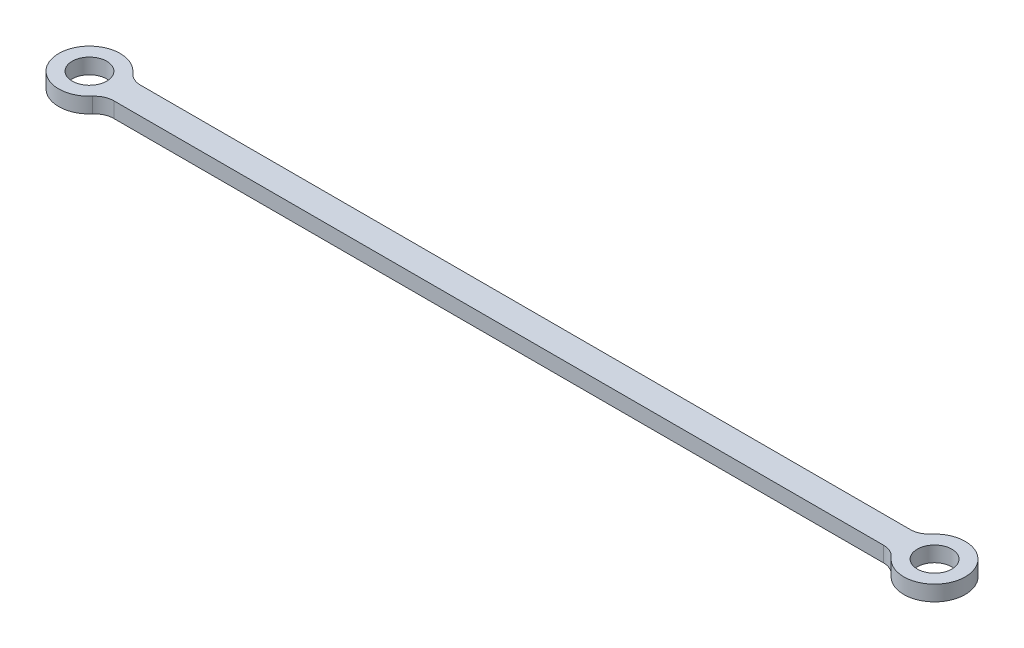
ISO-10303-21;
HEADER;
FILE_DESCRIPTION(('STEP AP214'),'2;1');
FILE_NAME('part.step','',(''),(''),'','','');
FILE_SCHEMA(('AUTOMOTIVE_DESIGN { 1 0 10303 214 1 1 1 1 }'));
ENDSEC;
DATA;
#1=APPLICATION_CONTEXT('core data for automotive mechanical design processes');
#2=APPLICATION_PROTOCOL_DEFINITION('international standard','automotive_design',2000,#1);
#3=PRODUCT_CONTEXT('',#1,'mechanical');
#4=PRODUCT('Part','Part','',(#3));
#5=PRODUCT_RELATED_PRODUCT_CATEGORY('part','',(#4));
#6=PRODUCT_DEFINITION_FORMATION('','',#4);
#7=PRODUCT_DEFINITION_CONTEXT('part definition',#1,'design');
#8=PRODUCT_DEFINITION('design','',#6,#7);
#9=PRODUCT_DEFINITION_SHAPE('','',#8);
#10=(LENGTH_UNIT() NAMED_UNIT(*) SI_UNIT(.MILLI.,.METRE.));
#11=(NAMED_UNIT(*) PLANE_ANGLE_UNIT() SI_UNIT($,.RADIAN.));
#12=(NAMED_UNIT(*) SI_UNIT($,.STERADIAN.) SOLID_ANGLE_UNIT());
#13=UNCERTAINTY_MEASURE_WITH_UNIT(LENGTH_MEASURE(1.E-05),#10,'distance_accuracy_value','');
#14=(GEOMETRIC_REPRESENTATION_CONTEXT(3) GLOBAL_UNCERTAINTY_ASSIGNED_CONTEXT((#13)) GLOBAL_UNIT_ASSIGNED_CONTEXT((#10,
#11,#12)) REPRESENTATION_CONTEXT('',''));
#15=CARTESIAN_POINT('',(0.,0.,0.));
#16=DIRECTION('',(0.,0.,1.));
#17=DIRECTION('',(1.,0.,0.));
#18=AXIS2_PLACEMENT_3D('',#15,#16,#17);
#19=CARTESIAN_POINT('',(-100.163842213547,4.,8.5));
#20=DIRECTION('',(0.,1.,0.));
#21=DIRECTION('',(0.,0.,1.));
#22=AXIS2_PLACEMENT_3D('',#19,#20,#21);
#23=PLANE('',#22);
#24=CARTESIAN_POINT('',(-110.,4.,0.));
#25=DIRECTION('',(0.,1.,0.));
#26=DIRECTION('',(0.,0.,1.));
#27=AXIS2_PLACEMENT_3D('',#24,#25,#26);
#28=CIRCLE('',#27,4.5);
#29=CARTESIAN_POINT('',(-110.,4.,4.5));
#30=VERTEX_POINT('',#29);
#31=EDGE_CURVE('E137',#30,#30,#28,.T.);
#32=ORIENTED_EDGE('',*,*,#31,.F.);
#33=EDGE_LOOP('',(#32));
#34=FACE_BOUND('',#33,.T.);
#35=CARTESIAN_POINT('',(-100.163842213547,4.,8.5));
#36=DIRECTION('',(0.,-1.,0.));
#37=DIRECTION('',(0.,0.,1.));
#38=AXIS2_PLACEMENT_3D('',#35,#36,#37);
#39=CIRCLE('',#38,5.);
#40=CARTESIAN_POINT('',(-103.946979823721,4.,5.23076923076923));
#41=VERTEX_POINT('',#40);
#42=CARTESIAN_POINT('',(-100.163842213547,4.,3.5));
#43=VERTEX_POINT('',#42);
#44=EDGE_CURVE('E148',#41,#43,#39,.T.);
#45=ORIENTED_EDGE('',*,*,#44,.T.);
#46=DIRECTION('',(1.,0.,0.));
#47=VECTOR('',#46,1.);
#48=CARTESIAN_POINT('',(100.163842213547,4.,3.5));
#49=LINE('',#48,#47);
#50=CARTESIAN_POINT('',(100.163842213547,4.,3.5));
#51=VERTEX_POINT('',#50);
#52=EDGE_CURVE('E96',#43,#51,#49,.T.);
#53=ORIENTED_EDGE('',*,*,#52,.T.);
#54=CARTESIAN_POINT('',(100.163842213547,4.,8.5));
#55=DIRECTION('',(0.,-1.,0.));
#56=DIRECTION('',(0.,0.,-1.));
#57=AXIS2_PLACEMENT_3D('',#54,#55,#56);
#58=CIRCLE('',#57,5.);
#59=CARTESIAN_POINT('',(103.946979823721,4.,5.23076923076923));
#60=VERTEX_POINT('',#59);
#61=EDGE_CURVE('E163',#51,#60,#58,.T.);
#62=ORIENTED_EDGE('',*,*,#61,.T.);
#63=CARTESIAN_POINT('',(110.,4.,0.));
#64=DIRECTION('',(0.,1.,0.));
#65=DIRECTION('',(0.,0.,-1.));
#66=AXIS2_PLACEMENT_3D('',#63,#64,#65);
#67=CIRCLE('',#66,8.00000000000001);
#68=CARTESIAN_POINT('',(103.946979823721,4.,-5.23076923076923));
#69=VERTEX_POINT('',#68);
#70=EDGE_CURVE('E176',#60,#69,#67,.T.);
#71=ORIENTED_EDGE('',*,*,#70,.T.);
#72=CARTESIAN_POINT('',(100.163842213547,4.,-8.5));
#73=DIRECTION('',(0.,-1.,0.));
#74=DIRECTION('',(0.,0.,1.));
#75=AXIS2_PLACEMENT_3D('',#72,#73,#74);
#76=CIRCLE('',#75,5.);
#77=CARTESIAN_POINT('',(100.163842213547,4.,-3.5));
#78=VERTEX_POINT('',#77);
#79=EDGE_CURVE('E115',#69,#78,#76,.T.);
#80=ORIENTED_EDGE('',*,*,#79,.T.);
#81=DIRECTION('',(-1.,0.,0.));
#82=VECTOR('',#81,1.);
#83=CARTESIAN_POINT('',(-100.163842213547,4.,-3.5));
#84=LINE('',#83,#82);
#85=CARTESIAN_POINT('',(-100.163842213547,4.,-3.5));
#86=VERTEX_POINT('',#85);
#87=EDGE_CURVE('E109',#78,#86,#84,.T.);
#88=ORIENTED_EDGE('',*,*,#87,.T.);
#89=CARTESIAN_POINT('',(-100.163842213547,4.,-8.5));
#90=DIRECTION('',(0.,-1.,0.));
#91=DIRECTION('',(0.,0.,-1.));
#92=AXIS2_PLACEMENT_3D('',#89,#90,#91);
#93=CIRCLE('',#92,5.);
#94=CARTESIAN_POINT('',(-103.946979823721,4.,-5.23076923076923));
#95=VERTEX_POINT('',#94);
#96=EDGE_CURVE('E113',#86,#95,#93,.T.);
#97=ORIENTED_EDGE('',*,*,#96,.T.);
#98=CARTESIAN_POINT('',(-110.,4.,0.));
#99=DIRECTION('',(0.,1.,0.));
#100=DIRECTION('',(0.,0.,1.));
#101=AXIS2_PLACEMENT_3D('',#98,#99,#100);
#102=CIRCLE('',#101,8.00000000000001);
#103=EDGE_CURVE('E53',#95,#41,#102,.T.);
#104=ORIENTED_EDGE('',*,*,#103,.T.);
#105=EDGE_LOOP('',(#45,#53,#62,#71,#80,#88,#97,#104));
#106=FACE_BOUND('',#105,.T.);
#107=CARTESIAN_POINT('',(110.,4.,0.));
#108=DIRECTION('',(0.,1.,0.));
#109=DIRECTION('',(0.,0.,1.));
#110=AXIS2_PLACEMENT_3D('',#107,#108,#109);
#111=CIRCLE('',#110,4.5);
#112=CARTESIAN_POINT('',(110.,4.,4.5));
#113=VERTEX_POINT('',#112);
#114=EDGE_CURVE('E185',#113,#113,#111,.T.);
#115=ORIENTED_EDGE('',*,*,#114,.F.);
#116=EDGE_LOOP('',(#115));
#117=FACE_BOUND('',#116,.T.);
#118=ADVANCED_FACE('F36',(#34,#106,#117),#23,.T.);
#119=CARTESIAN_POINT('',(-100.163842213547,0.,8.5));
#120=DIRECTION('',(0.,1.,0.));
#121=DIRECTION('',(0.,0.,1.));
#122=AXIS2_PLACEMENT_3D('',#119,#120,#121);
#123=PLANE('',#122);
#124=CARTESIAN_POINT('',(-100.163842213547,0.,8.5));
#125=DIRECTION('',(0.,-1.,0.));
#126=DIRECTION('',(0.,0.,1.));
#127=AXIS2_PLACEMENT_3D('',#124,#125,#126);
#128=CIRCLE('',#127,5.);
#129=CARTESIAN_POINT('',(-103.946979823721,0.,5.23076923076923));
#130=VERTEX_POINT('',#129);
#131=CARTESIAN_POINT('',(-100.163842213547,0.,3.5));
#132=VERTEX_POINT('',#131);
#133=EDGE_CURVE('E133',#130,#132,#128,.T.);
#134=ORIENTED_EDGE('',*,*,#133,.F.);
#135=CARTESIAN_POINT('',(-110.,0.,0.));
#136=DIRECTION('',(0.,1.,0.));
#137=DIRECTION('',(0.,0.,1.));
#138=AXIS2_PLACEMENT_3D('',#135,#136,#137);
#139=CIRCLE('',#138,8.00000000000001);
#140=CARTESIAN_POINT('',(-103.946979823721,0.,-5.23076923076923));
#141=VERTEX_POINT('',#140);
#142=EDGE_CURVE('E88',#141,#130,#139,.T.);
#143=ORIENTED_EDGE('',*,*,#142,.F.);
#144=CARTESIAN_POINT('',(-100.163842213547,0.,-8.5));
#145=DIRECTION('',(0.,-1.,0.));
#146=DIRECTION('',(0.,0.,-1.));
#147=AXIS2_PLACEMENT_3D('',#144,#145,#146);
#148=CIRCLE('',#147,5.);
#149=CARTESIAN_POINT('',(-100.163842213547,0.,-3.5));
#150=VERTEX_POINT('',#149);
#151=EDGE_CURVE('E82',#150,#141,#148,.T.);
#152=ORIENTED_EDGE('',*,*,#151,.F.);
#153=DIRECTION('',(-1.,0.,0.));
#154=VECTOR('',#153,1.);
#155=CARTESIAN_POINT('',(-100.163842213547,0.,-3.5));
#156=LINE('',#155,#154);
#157=CARTESIAN_POINT('',(100.163842213547,0.,-3.5));
#158=VERTEX_POINT('',#157);
#159=EDGE_CURVE('E123',#158,#150,#156,.T.);
#160=ORIENTED_EDGE('',*,*,#159,.F.);
#161=CARTESIAN_POINT('',(100.163842213547,0.,-8.5));
#162=DIRECTION('',(0.,-1.,0.));
#163=DIRECTION('',(0.,0.,1.));
#164=AXIS2_PLACEMENT_3D('',#161,#162,#163);
#165=CIRCLE('',#164,5.);
#166=CARTESIAN_POINT('',(103.946979823721,0.,-5.23076923076923));
#167=VERTEX_POINT('',#166);
#168=EDGE_CURVE('E143',#167,#158,#165,.T.);
#169=ORIENTED_EDGE('',*,*,#168,.F.);
#170=CARTESIAN_POINT('',(110.,0.,0.));
#171=DIRECTION('',(0.,1.,0.));
#172=DIRECTION('',(0.,0.,-1.));
#173=AXIS2_PLACEMENT_3D('',#170,#171,#172);
#174=CIRCLE('',#173,8.00000000000001);
#175=CARTESIAN_POINT('',(103.946979823721,0.,5.23076923076923));
#176=VERTEX_POINT('',#175);
#177=EDGE_CURVE('E141',#176,#167,#174,.T.);
#178=ORIENTED_EDGE('',*,*,#177,.F.);
#179=CARTESIAN_POINT('',(100.163842213547,0.,8.5));
#180=DIRECTION('',(0.,-1.,0.));
#181=DIRECTION('',(0.,0.,-1.));
#182=AXIS2_PLACEMENT_3D('',#179,#180,#181);
#183=CIRCLE('',#182,5.);
#184=CARTESIAN_POINT('',(100.163842213547,0.,3.5));
#185=VERTEX_POINT('',#184);
#186=EDGE_CURVE('E139',#185,#176,#183,.T.);
#187=ORIENTED_EDGE('',*,*,#186,.F.);
#188=DIRECTION('',(1.,0.,0.));
#189=VECTOR('',#188,1.);
#190=CARTESIAN_POINT('',(100.163842213547,0.,3.5));
#191=LINE('',#190,#189);
#192=EDGE_CURVE('E136',#132,#185,#191,.T.);
#193=ORIENTED_EDGE('',*,*,#192,.F.);
#194=EDGE_LOOP('',(#134,#143,#152,#160,#169,#178,#187,#193));
#195=FACE_BOUND('',#194,.T.);
#196=CARTESIAN_POINT('',(-110.,0.,0.));
#197=DIRECTION('',(0.,1.,0.));
#198=DIRECTION('',(0.,0.,1.));
#199=AXIS2_PLACEMENT_3D('',#196,#197,#198);
#200=CIRCLE('',#199,4.5);
#201=CARTESIAN_POINT('',(-110.,0.,4.5));
#202=VERTEX_POINT('',#201);
#203=EDGE_CURVE('E182',#202,#202,#200,.T.);
#204=ORIENTED_EDGE('',*,*,#203,.T.);
#205=EDGE_LOOP('',(#204));
#206=FACE_BOUND('',#205,.T.);
#207=CARTESIAN_POINT('',(110.,0.,0.));
#208=DIRECTION('',(0.,1.,0.));
#209=DIRECTION('',(0.,0.,1.));
#210=AXIS2_PLACEMENT_3D('',#207,#208,#209);
#211=CIRCLE('',#210,4.5);
#212=CARTESIAN_POINT('',(110.,0.,4.5));
#213=VERTEX_POINT('',#212);
#214=EDGE_CURVE('E188',#213,#213,#211,.T.);
#215=ORIENTED_EDGE('',*,*,#214,.T.);
#216=EDGE_LOOP('',(#215));
#217=FACE_BOUND('',#216,.T.);
#218=ADVANCED_FACE('F167',(#195,#206,#217),#123,.F.);
#219=CARTESIAN_POINT('',(-100.163842213547,4.,8.5));
#220=DIRECTION('',(0.,-1.,0.));
#221=DIRECTION('',(0.,0.,-1.));
#222=AXIS2_PLACEMENT_3D('',#219,#220,#221);
#223=CYLINDRICAL_SURFACE('',#222,5.);
#224=ORIENTED_EDGE('',*,*,#133,.T.);
#225=DIRECTION('',(0.,-1.,0.));
#226=VECTOR('',#225,1.);
#227=CARTESIAN_POINT('',(-100.163842213547,4.,3.5));
#228=LINE('',#227,#226);
#229=EDGE_CURVE('E11',#43,#132,#228,.T.);
#230=ORIENTED_EDGE('',*,*,#229,.F.);
#231=ORIENTED_EDGE('',*,*,#44,.F.);
#232=DIRECTION('',(0.,-1.,0.));
#233=VECTOR('',#232,1.);
#234=CARTESIAN_POINT('',(-103.946979823721,4.,5.23076923076923));
#235=LINE('',#234,#233);
#236=EDGE_CURVE('E129',#41,#130,#235,.T.);
#237=ORIENTED_EDGE('',*,*,#236,.T.);
#238=EDGE_LOOP('',(#224,#230,#231,#237));
#239=FACE_BOUND('',#238,.T.);
#240=ADVANCED_FACE('F38',(#239),#223,.F.);
#241=CARTESIAN_POINT('',(100.163842213547,4.,3.5));
#242=DIRECTION('',(0.,0.,-1.));
#243=DIRECTION('',(-1.,0.,0.));
#244=AXIS2_PLACEMENT_3D('',#241,#242,#243);
#245=PLANE('',#244);
#246=ORIENTED_EDGE('',*,*,#192,.T.);
#247=DIRECTION('',(0.,-1.,0.));
#248=VECTOR('',#247,1.);
#249=CARTESIAN_POINT('',(100.163842213547,4.,3.5));
#250=LINE('',#249,#248);
#251=EDGE_CURVE('E45',#51,#185,#250,.T.);
#252=ORIENTED_EDGE('',*,*,#251,.F.);
#253=ORIENTED_EDGE('',*,*,#52,.F.);
#254=ORIENTED_EDGE('',*,*,#229,.T.);
#255=EDGE_LOOP('',(#246,#252,#253,#254));
#256=FACE_BOUND('',#255,.T.);
#257=ADVANCED_FACE('F220',(#256),#245,.F.);
#258=CARTESIAN_POINT('',(100.163842213547,4.,8.5));
#259=DIRECTION('',(0.,-1.,0.));
#260=DIRECTION('',(0.,0.,-1.));
#261=AXIS2_PLACEMENT_3D('',#258,#259,#260);
#262=CYLINDRICAL_SURFACE('',#261,5.);
#263=ORIENTED_EDGE('',*,*,#186,.T.);
#264=DIRECTION('',(0.,-1.,0.));
#265=VECTOR('',#264,1.);
#266=CARTESIAN_POINT('',(103.946979823721,4.,5.23076923076923));
#267=LINE('',#266,#265);
#268=EDGE_CURVE('E155',#60,#176,#267,.T.);
#269=ORIENTED_EDGE('',*,*,#268,.F.);
#270=ORIENTED_EDGE('',*,*,#61,.F.);
#271=ORIENTED_EDGE('',*,*,#251,.T.);
#272=EDGE_LOOP('',(#263,#269,#270,#271));
#273=FACE_BOUND('',#272,.T.);
#274=ADVANCED_FACE('F161',(#273),#262,.F.);
#275=CARTESIAN_POINT('',(110.,4.,0.));
#276=DIRECTION('',(0.,-1.,0.));
#277=DIRECTION('',(0.,0.,-1.));
#278=AXIS2_PLACEMENT_3D('',#275,#276,#277);
#279=CYLINDRICAL_SURFACE('',#278,8.00000000000001);
#280=ORIENTED_EDGE('',*,*,#177,.T.);
#281=DIRECTION('',(0.,-1.,0.));
#282=VECTOR('',#281,1.);
#283=CARTESIAN_POINT('',(103.946979823721,4.,-5.23076923076923));
#284=LINE('',#283,#282);
#285=EDGE_CURVE('E152',#69,#167,#284,.T.);
#286=ORIENTED_EDGE('',*,*,#285,.F.);
#287=ORIENTED_EDGE('',*,*,#70,.F.);
#288=ORIENTED_EDGE('',*,*,#268,.T.);
#289=EDGE_LOOP('',(#280,#286,#287,#288));
#290=FACE_BOUND('',#289,.T.);
#291=ADVANCED_FACE('F172',(#290),#279,.T.);
#292=CARTESIAN_POINT('',(100.163842213547,4.,-8.5));
#293=DIRECTION('',(0.,-1.,0.));
#294=DIRECTION('',(0.,0.,-1.));
#295=AXIS2_PLACEMENT_3D('',#292,#293,#294);
#296=CYLINDRICAL_SURFACE('',#295,5.);
#297=ORIENTED_EDGE('',*,*,#168,.T.);
#298=DIRECTION('',(0.,-1.,0.));
#299=VECTOR('',#298,1.);
#300=CARTESIAN_POINT('',(100.163842213547,4.,-3.5));
#301=LINE('',#300,#299);
#302=EDGE_CURVE('E124',#78,#158,#301,.T.);
#303=ORIENTED_EDGE('',*,*,#302,.F.);
#304=ORIENTED_EDGE('',*,*,#79,.F.);
#305=ORIENTED_EDGE('',*,*,#285,.T.);
#306=EDGE_LOOP('',(#297,#303,#304,#305));
#307=FACE_BOUND('',#306,.T.);
#308=ADVANCED_FACE('F175',(#307),#296,.F.);
#309=CARTESIAN_POINT('',(-100.163842213547,4.,-3.5));
#310=DIRECTION('',(0.,0.,1.));
#311=DIRECTION('',(1.,0.,0.));
#312=AXIS2_PLACEMENT_3D('',#309,#310,#311);
#313=PLANE('',#312);
#314=ORIENTED_EDGE('',*,*,#159,.T.);
#315=DIRECTION('',(0.,-1.,0.));
#316=VECTOR('',#315,1.);
#317=CARTESIAN_POINT('',(-100.163842213547,4.,-3.5));
#318=LINE('',#317,#316);
#319=EDGE_CURVE('E120',#86,#150,#318,.T.);
#320=ORIENTED_EDGE('',*,*,#319,.F.);
#321=ORIENTED_EDGE('',*,*,#87,.F.);
#322=ORIENTED_EDGE('',*,*,#302,.T.);
#323=EDGE_LOOP('',(#314,#320,#321,#322));
#324=FACE_BOUND('',#323,.T.);
#325=ADVANCED_FACE('F121',(#324),#313,.F.);
#326=CARTESIAN_POINT('',(-100.163842213547,4.,-8.5));
#327=DIRECTION('',(0.,-1.,0.));
#328=DIRECTION('',(0.,0.,-1.));
#329=AXIS2_PLACEMENT_3D('',#326,#327,#328);
#330=CYLINDRICAL_SURFACE('',#329,5.);
#331=ORIENTED_EDGE('',*,*,#151,.T.);
#332=DIRECTION('',(0.,-1.,0.));
#333=VECTOR('',#332,1.);
#334=CARTESIAN_POINT('',(-103.946979823721,4.,-5.23076923076923));
#335=LINE('',#334,#333);
#336=EDGE_CURVE('E125',#95,#141,#335,.T.);
#337=ORIENTED_EDGE('',*,*,#336,.F.);
#338=ORIENTED_EDGE('',*,*,#96,.F.);
#339=ORIENTED_EDGE('',*,*,#319,.T.);
#340=EDGE_LOOP('',(#331,#337,#338,#339));
#341=FACE_BOUND('',#340,.T.);
#342=ADVANCED_FACE('F127',(#341),#330,.F.);
#343=CARTESIAN_POINT('',(-110.,4.,0.));
#344=DIRECTION('',(0.,-1.,0.));
#345=DIRECTION('',(0.,0.,-1.));
#346=AXIS2_PLACEMENT_3D('',#343,#344,#345);
#347=CYLINDRICAL_SURFACE('',#346,8.00000000000001);
#348=ORIENTED_EDGE('',*,*,#142,.T.);
#349=ORIENTED_EDGE('',*,*,#236,.F.);
#350=ORIENTED_EDGE('',*,*,#103,.F.);
#351=ORIENTED_EDGE('',*,*,#336,.T.);
#352=EDGE_LOOP('',(#348,#349,#350,#351));
#353=FACE_BOUND('',#352,.T.);
#354=ADVANCED_FACE('F208',(#353),#347,.T.);
#355=CARTESIAN_POINT('',(-110.,4.,0.));
#356=DIRECTION('',(0.,-1.,0.));
#357=DIRECTION('',(0.,0.,-1.));
#358=AXIS2_PLACEMENT_3D('',#355,#356,#357);
#359=CYLINDRICAL_SURFACE('',#358,4.5);
#360=ORIENTED_EDGE('',*,*,#31,.T.);
#361=EDGE_LOOP('',(#360));
#362=FACE_BOUND('',#361,.T.);
#363=ORIENTED_EDGE('',*,*,#203,.F.);
#364=EDGE_LOOP('',(#363));
#365=FACE_BOUND('',#364,.T.);
#366=ADVANCED_FACE('F205',(#362,#365),#359,.F.);
#367=CARTESIAN_POINT('',(110.,4.,0.));
#368=DIRECTION('',(0.,-1.,0.));
#369=DIRECTION('',(0.,0.,-1.));
#370=AXIS2_PLACEMENT_3D('',#367,#368,#369);
#371=CYLINDRICAL_SURFACE('',#370,4.5);
#372=ORIENTED_EDGE('',*,*,#114,.T.);
#373=EDGE_LOOP('',(#372));
#374=FACE_BOUND('',#373,.T.);
#375=ORIENTED_EDGE('',*,*,#214,.F.);
#376=EDGE_LOOP('',(#375));
#377=FACE_BOUND('',#376,.T.);
#378=ADVANCED_FACE('F194',(#374,#377),#371,.F.);
#379=CLOSED_SHELL('',(#118,#218,#240,#257,#274,#291,#308,#325,#342,#354,#366,#378));
#380=MANIFOLD_SOLID_BREP('B2',#379);
#381=ADVANCED_BREP_SHAPE_REPRESENTATION('',(#18,#380),#14);
#382=SHAPE_DEFINITION_REPRESENTATION(#9,#381);
ENDSEC;
END-ISO-10303-21;
